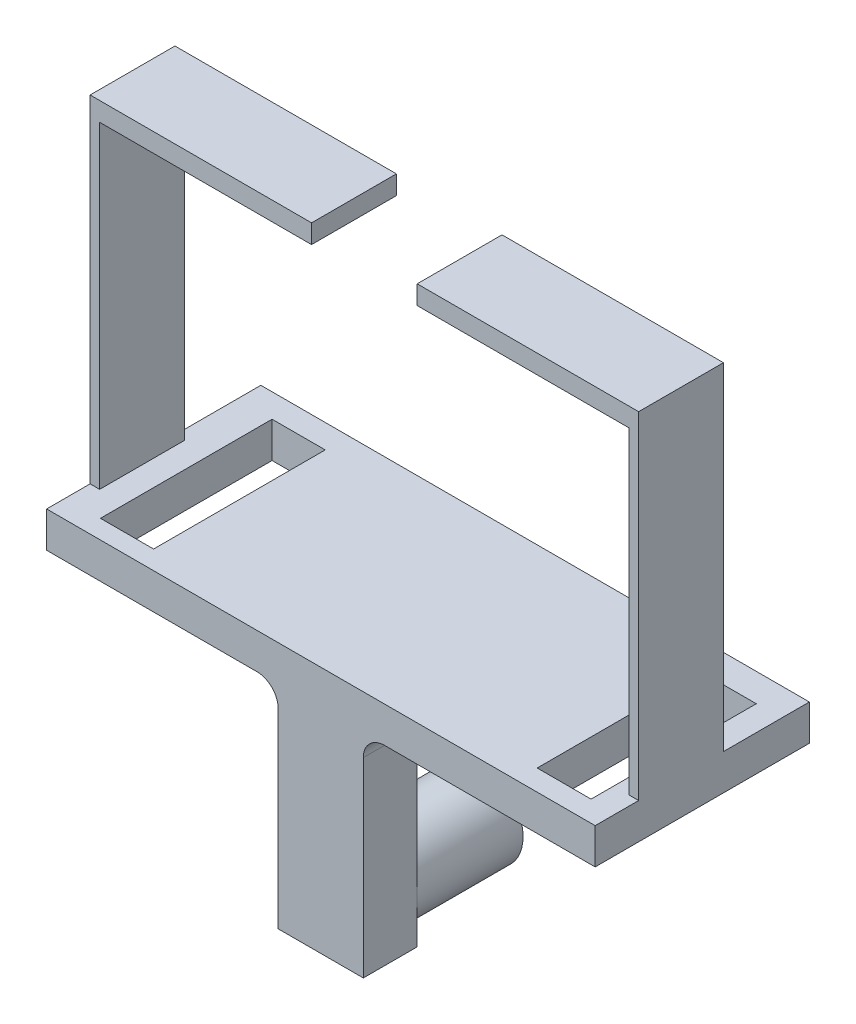
ISO-10303-21;
HEADER;
FILE_DESCRIPTION(('STEP AP214'),'2;1');
FILE_NAME('part.step','',(''),(''),'','','');
FILE_SCHEMA(('AUTOMOTIVE_DESIGN { 1 0 10303 214 1 1 1 1 }'));
ENDSEC;
DATA;
#1=APPLICATION_CONTEXT('core data for automotive mechanical design processes');
#2=APPLICATION_PROTOCOL_DEFINITION('international standard','automotive_design',2000,#1);
#3=PRODUCT_CONTEXT('',#1,'mechanical');
#4=PRODUCT('Part','Part','',(#3));
#5=PRODUCT_RELATED_PRODUCT_CATEGORY('part','',(#4));
#6=PRODUCT_DEFINITION_FORMATION('','',#4);
#7=PRODUCT_DEFINITION_CONTEXT('part definition',#1,'design');
#8=PRODUCT_DEFINITION('design','',#6,#7);
#9=PRODUCT_DEFINITION_SHAPE('','',#8);
#10=(LENGTH_UNIT() NAMED_UNIT(*) SI_UNIT(.MILLI.,.METRE.));
#11=(NAMED_UNIT(*) PLANE_ANGLE_UNIT() SI_UNIT($,.RADIAN.));
#12=(NAMED_UNIT(*) SI_UNIT($,.STERADIAN.) SOLID_ANGLE_UNIT());
#13=UNCERTAINTY_MEASURE_WITH_UNIT(LENGTH_MEASURE(1.E-05),#10,'distance_accuracy_value','');
#14=(GEOMETRIC_REPRESENTATION_CONTEXT(3) GLOBAL_UNCERTAINTY_ASSIGNED_CONTEXT((#13)) GLOBAL_UNIT_ASSIGNED_CONTEXT((#10,
#11,#12)) REPRESENTATION_CONTEXT('',''));
#15=CARTESIAN_POINT('',(0.,0.,0.));
#16=DIRECTION('',(0.,0.,1.));
#17=DIRECTION('',(1.,0.,0.));
#18=AXIS2_PLACEMENT_3D('',#15,#16,#17);
#19=CARTESIAN_POINT('',(0.,29.68752,0.));
#20=DIRECTION('',(0.,-1.,0.));
#21=DIRECTION('',(0.,0.,-1.));
#22=AXIS2_PLACEMENT_3D('',#19,#20,#21);
#23=PLANE('',#22);
#24=DIRECTION('',(0.,0.,1.));
#25=VECTOR('',#24,1.);
#26=CARTESIAN_POINT('',(-40.8068433770587,29.68752,-30.4384638888355));
#27=LINE('',#26,#25);
#28=CARTESIAN_POINT('',(-40.8068433770587,29.68752,-30.4384638888355));
#29=VERTEX_POINT('',#28);
#30=CARTESIAN_POINT('',(-40.8068433770587,29.68752,-9.88129462476957));
#31=VERTEX_POINT('',#30);
#32=EDGE_CURVE('E471',#29,#31,#27,.T.);
#33=ORIENTED_EDGE('',*,*,#32,.F.);
#34=DIRECTION('',(-1.,0.,0.));
#35=VECTOR('',#34,1.);
#36=CARTESIAN_POINT('',(-40.8068433770587,29.68752,-30.4384638888355));
#37=LINE('',#36,#35);
#38=CARTESIAN_POINT('',(-34.4388221289384,29.68752,-30.4384638888355));
#39=VERTEX_POINT('',#38);
#40=EDGE_CURVE('E485',#39,#29,#37,.T.);
#41=ORIENTED_EDGE('',*,*,#40,.F.);
#42=DIRECTION('',(0.,0.,-1.));
#43=VECTOR('',#42,1.);
#44=CARTESIAN_POINT('',(-34.4388221289384,29.68752,-30.4384638888355));
#45=LINE('',#44,#43);
#46=CARTESIAN_POINT('',(-34.4388221289384,29.68752,-9.88129462476957));
#47=VERTEX_POINT('',#46);
#48=EDGE_CURVE('E478',#47,#39,#45,.T.);
#49=ORIENTED_EDGE('',*,*,#48,.F.);
#50=DIRECTION('',(1.,0.,0.));
#51=VECTOR('',#50,1.);
#52=CARTESIAN_POINT('',(-40.8068433770587,29.68752,-9.88129462476957));
#53=LINE('',#52,#51);
#54=EDGE_CURVE('E477',#31,#47,#53,.T.);
#55=ORIENTED_EDGE('',*,*,#54,.F.);
#56=EDGE_LOOP('',(#33,#41,#49,#55));
#57=FACE_BOUND('',#56,.T.);
#58=DIRECTION('',(0.,0.,1.));
#59=VECTOR('',#58,1.);
#60=CARTESIAN_POINT('',(11.2485249465012,29.68752,-29.9256031171748));
#61=LINE('',#60,#59);
#62=CARTESIAN_POINT('',(11.2485249465012,29.68752,-29.9256031171748));
#63=VERTEX_POINT('',#62);
#64=CARTESIAN_POINT('',(11.2485249465012,29.68752,-10.1377250105999));
#65=VERTEX_POINT('',#64);
#66=EDGE_CURVE('E429',#63,#65,#61,.T.);
#67=ORIENTED_EDGE('',*,*,#66,.F.);
#68=DIRECTION('',(-1.,0.,0.));
#69=VECTOR('',#68,1.);
#70=CARTESIAN_POINT('',(11.2485249465012,29.68752,-29.9256031171748));
#71=LINE('',#70,#69);
#72=CARTESIAN_POINT('',(17.7020229898982,29.68752,-29.9256031171748));
#73=VERTEX_POINT('',#72);
#74=EDGE_CURVE('E444',#73,#63,#71,.T.);
#75=ORIENTED_EDGE('',*,*,#74,.F.);
#76=DIRECTION('',(0.,0.,-1.));
#77=VECTOR('',#76,1.);
#78=CARTESIAN_POINT('',(17.7020229898982,29.68752,-29.9256031171748));
#79=LINE('',#78,#77);
#80=CARTESIAN_POINT('',(17.7020229898982,29.68752,-10.1377250105999));
#81=VERTEX_POINT('',#80);
#82=EDGE_CURVE('E440',#81,#73,#79,.T.);
#83=ORIENTED_EDGE('',*,*,#82,.F.);
#84=DIRECTION('',(1.,0.,0.));
#85=VECTOR('',#84,1.);
#86=CARTESIAN_POINT('',(11.2485249465012,29.68752,-10.1377250105999));
#87=LINE('',#86,#85);
#88=EDGE_CURVE('E434',#65,#81,#87,.T.);
#89=ORIENTED_EDGE('',*,*,#88,.F.);
#90=EDGE_LOOP('',(#67,#75,#83,#89));
#91=FACE_BOUND('',#90,.T.);
#92=DIRECTION('',(1.,0.,0.));
#93=VECTOR('',#92,1.);
#94=CARTESIAN_POINT('',(-44.9980277605177,29.68752,-12.8390480402712));
#95=LINE('',#94,#93);
#96=CARTESIAN_POINT('',(-44.9980277605177,29.68752,-12.8390480402712));
#97=VERTEX_POINT('',#96);
#98=CARTESIAN_POINT('',(-43.8550277605177,29.68752,-12.8390480402712));
#99=VERTEX_POINT('',#98);
#100=EDGE_CURVE('E380',#97,#99,#95,.T.);
#101=ORIENTED_EDGE('',*,*,#100,.F.);
#102=DIRECTION('',(0.,0.,1.));
#103=VECTOR('',#102,1.);
#104=CARTESIAN_POINT('',(-44.9980277605177,29.68752,-7.63204804027117));
#105=LINE('',#104,#103);
#106=CARTESIAN_POINT('',(-44.9980277605177,29.68752,-7.63204804027117));
#107=VERTEX_POINT('',#106);
#108=EDGE_CURVE('E295',#97,#107,#105,.T.);
#109=ORIENTED_EDGE('',*,*,#108,.T.);
#110=DIRECTION('',(1.,0.,0.));
#111=VECTOR('',#110,1.);
#112=CARTESIAN_POINT('',(-44.9980277605177,29.68752,-7.63204804027117));
#113=LINE('',#112,#111);
#114=CARTESIAN_POINT('',(20.6965322394823,29.68752,-7.63204804027119));
#115=VERTEX_POINT('',#114);
#116=EDGE_CURVE('E527',#107,#115,#113,.T.);
#117=ORIENTED_EDGE('',*,*,#116,.T.);
#118=DIRECTION('',(0.,0.,-1.));
#119=VECTOR('',#118,1.);
#120=CARTESIAN_POINT('',(20.6965322394823,29.68752,-7.63204804027119));
#121=LINE('',#120,#119);
#122=CARTESIAN_POINT('',(20.6965322394823,29.68752,-12.8390480402712));
#123=VERTEX_POINT('',#122);
#124=EDGE_CURVE('E519',#115,#123,#121,.T.);
#125=ORIENTED_EDGE('',*,*,#124,.T.);
#126=DIRECTION('',(1.,0.,0.));
#127=VECTOR('',#126,1.);
#128=CARTESIAN_POINT('',(20.6965322394823,29.68752,-12.8390480402712));
#129=LINE('',#128,#127);
#130=CARTESIAN_POINT('',(19.5535322394823,29.68752,-12.8390480402712));
#131=VERTEX_POINT('',#130);
#132=EDGE_CURVE('E416',#131,#123,#129,.T.);
#133=ORIENTED_EDGE('',*,*,#132,.F.);
#134=DIRECTION('',(0.,0.,1.));
#135=VECTOR('',#134,1.);
#136=CARTESIAN_POINT('',(19.5535322394823,29.68752,-22.9990480402712));
#137=LINE('',#136,#135);
#138=CARTESIAN_POINT('',(19.5535322394823,29.68752,-22.9990480402712));
#139=VERTEX_POINT('',#138);
#140=EDGE_CURVE('E419',#139,#131,#137,.T.);
#141=ORIENTED_EDGE('',*,*,#140,.F.);
#142=DIRECTION('',(-1.,0.,0.));
#143=VECTOR('',#142,1.);
#144=CARTESIAN_POINT('',(20.6965322394823,29.68752,-22.9990480402712));
#145=LINE('',#144,#143);
#146=CARTESIAN_POINT('',(20.6965322394823,29.68752,-22.9990480402712));
#147=VERTEX_POINT('',#146);
#148=EDGE_CURVE('E384',#147,#139,#145,.T.);
#149=ORIENTED_EDGE('',*,*,#148,.F.);
#150=CARTESIAN_POINT('',(20.6965322394823,29.68752,-33.2860480402712));
#151=VERTEX_POINT('',#150);
#152=EDGE_CURVE('E517',#147,#151,#121,.T.);
#153=ORIENTED_EDGE('',*,*,#152,.T.);
#154=DIRECTION('',(-1.,0.,0.));
#155=VECTOR('',#154,1.);
#156=CARTESIAN_POINT('',(-44.9980277605177,29.68752,-33.2860480402712));
#157=LINE('',#156,#155);
#158=CARTESIAN_POINT('',(-44.9980277605177,29.68752,-33.2860480402712));
#159=VERTEX_POINT('',#158);
#160=EDGE_CURVE('E518',#151,#159,#157,.T.);
#161=ORIENTED_EDGE('',*,*,#160,.T.);
#162=CARTESIAN_POINT('',(-44.9980277605177,29.68752,-22.9990480402712));
#163=VERTEX_POINT('',#162);
#164=EDGE_CURVE('E521',#159,#163,#105,.T.);
#165=ORIENTED_EDGE('',*,*,#164,.T.);
#166=DIRECTION('',(-1.,0.,0.));
#167=VECTOR('',#166,1.);
#168=CARTESIAN_POINT('',(-44.9980277605177,29.68752,-22.9990480402712));
#169=LINE('',#168,#167);
#170=CARTESIAN_POINT('',(-43.8550277605177,29.68752,-22.9990480402712));
#171=VERTEX_POINT('',#170);
#172=EDGE_CURVE('E381',#171,#163,#169,.T.);
#173=ORIENTED_EDGE('',*,*,#172,.F.);
#174=DIRECTION('',(0.,0.,-1.));
#175=VECTOR('',#174,1.);
#176=CARTESIAN_POINT('',(-43.8550277605177,29.68752,-12.8390480402712));
#177=LINE('',#176,#175);
#178=EDGE_CURVE('E376',#99,#171,#177,.T.);
#179=ORIENTED_EDGE('',*,*,#178,.F.);
#180=EDGE_LOOP('',(#101,#109,#117,#125,#133,#141,#149,#153,#161,#165,#173,#179));
#181=FACE_BOUND('',#180,.T.);
#182=ADVANCED_FACE('F72',(#57,#91,#181),#23,.F.);
#183=CARTESIAN_POINT('',(-17.2688477605177,25.4,-14.0633280402712));
#184=DIRECTION('',(0.,0.,1.));
#185=DIRECTION('',(1.,0.,0.));
#186=AXIS2_PLACEMENT_3D('',#183,#184,#185);
#187=PLANE('',#186);
#188=DIRECTION('',(0.,-1.,0.));
#189=VECTOR('',#188,1.);
#190=CARTESIAN_POINT('',(-17.2688477605177,25.4,-14.0633280402712));
#191=LINE('',#190,#189);
#192=CARTESIAN_POINT('',(-17.2688477605177,5.098542,-14.0633280402712));
#193=VERTEX_POINT('',#192);
#194=CARTESIAN_POINT('',(-17.2688477605177,0.,-14.0633280402712));
#195=VERTEX_POINT('',#194);
#196=EDGE_CURVE('E586',#193,#195,#191,.T.);
#197=ORIENTED_EDGE('',*,*,#196,.F.);
#198=CARTESIAN_POINT('',(-12.1697977605177,5.098542,-14.0633280402712));
#199=DIRECTION('',(0.,0.,1.));
#200=DIRECTION('',(1.,0.,0.));
#201=AXIS2_PLACEMENT_3D('',#198,#199,#200);
#202=CIRCLE('',#201,5.09905);
#203=CARTESIAN_POINT('',(-12.241772594564,0.,-14.0633280402712));
#204=VERTEX_POINT('',#203);
#205=EDGE_CURVE('E575',#193,#204,#202,.T.);
#206=ORIENTED_EDGE('',*,*,#205,.T.);
#207=DIRECTION('',(-1.,0.,0.));
#208=VECTOR('',#207,1.);
#209=CARTESIAN_POINT('',(-17.2688477605177,0.,-14.0633280402712));
#210=LINE('',#209,#208);
#211=EDGE_CURVE('E599',#204,#195,#210,.T.);
#212=ORIENTED_EDGE('',*,*,#211,.T.);
#213=EDGE_LOOP('',(#197,#206,#212));
#214=FACE_BOUND('',#213,.T.);
#215=ADVANCED_FACE('F679',(#214),#187,.F.);
#216=CARTESIAN_POINT('',(-17.2688477605177,22.86,-14.0633280402712));
#217=VERTEX_POINT('',#216);
#218=EDGE_CURVE('E598',#217,#193,#191,.T.);
#219=ORIENTED_EDGE('',*,*,#218,.F.);
#220=DIRECTION('',(-1.,0.,0.));
#221=VECTOR('',#220,1.);
#222=CARTESIAN_POINT('',(-17.2688477605177,22.86,-14.0633280402712));
#223=LINE('',#222,#221);
#224=CARTESIAN_POINT('',(-7.0707477605177,22.86,-14.0633280402712));
#225=VERTEX_POINT('',#224);
#226=EDGE_CURVE('E603',#217,#225,#223,.F.);
#227=ORIENTED_EDGE('',*,*,#226,.T.);
#228=DIRECTION('',(0.,-1.,0.));
#229=VECTOR('',#228,1.);
#230=CARTESIAN_POINT('',(-7.0707477605177,25.4,-14.0633280402712));
#231=LINE('',#230,#229);
#232=CARTESIAN_POINT('',(-7.0707477605177,5.098542,-14.0633280402712));
#233=VERTEX_POINT('',#232);
#234=EDGE_CURVE('E638',#225,#233,#231,.T.);
#235=ORIENTED_EDGE('',*,*,#234,.T.);
#236=EDGE_CURVE('E560',#233,#193,#202,.T.);
#237=ORIENTED_EDGE('',*,*,#236,.T.);
#238=EDGE_LOOP('',(#219,#227,#235,#237));
#239=FACE_BOUND('',#238,.T.);
#240=ADVANCED_FACE('F634',(#239),#187,.F.);
#241=CARTESIAN_POINT('',(-17.2688477605177,25.4,-14.0633280402712));
#242=DIRECTION('',(1.,0.,0.));
#243=DIRECTION('',(0.,0.,-1.));
#244=AXIS2_PLACEMENT_3D('',#241,#242,#243);
#245=PLANE('',#244);
#246=DIRECTION('',(0.,-1.,0.));
#247=VECTOR('',#246,1.);
#248=CARTESIAN_POINT('',(-17.2688477605177,25.4,-7.63204804027118));
#249=LINE('',#248,#247);
#250=CARTESIAN_POINT('',(-17.2688477605177,22.86,-7.63204804027118));
#251=VERTEX_POINT('',#250);
#252=CARTESIAN_POINT('',(-17.2688477605177,0.,-7.63204804027118));
#253=VERTEX_POINT('',#252);
#254=EDGE_CURVE('E579',#251,#253,#249,.T.);
#255=ORIENTED_EDGE('',*,*,#254,.F.);
#256=DIRECTION('',(0.,0.,1.));
#257=VECTOR('',#256,1.);
#258=CARTESIAN_POINT('',(-17.2688477605177,22.86,-14.0633280402712));
#259=LINE('',#258,#257);
#260=EDGE_CURVE('E614',#251,#217,#259,.F.);
#261=ORIENTED_EDGE('',*,*,#260,.T.);
#262=ORIENTED_EDGE('',*,*,#218,.T.);
#263=ORIENTED_EDGE('',*,*,#196,.T.);
#264=DIRECTION('',(0.,0.,1.));
#265=VECTOR('',#264,1.);
#266=CARTESIAN_POINT('',(-17.2688477605177,0.,-14.0633280402712));
#267=LINE('',#266,#265);
#268=EDGE_CURVE('E564',#195,#253,#267,.T.);
#269=ORIENTED_EDGE('',*,*,#268,.T.);
#270=EDGE_LOOP('',(#255,#261,#262,#263,#269));
#271=FACE_BOUND('',#270,.T.);
#272=ADVANCED_FACE('F689',(#271),#245,.F.);
#273=CARTESIAN_POINT('',(-17.2688477605177,25.4,-7.63204804027118));
#274=DIRECTION('',(0.,0.,-1.));
#275=DIRECTION('',(-1.,0.,0.));
#276=AXIS2_PLACEMENT_3D('',#273,#274,#275);
#277=PLANE('',#276);
#278=DIRECTION('',(1.,0.,0.));
#279=VECTOR('',#278,1.);
#280=CARTESIAN_POINT('',(-17.2688477605177,0.,-7.63204804027118));
#281=LINE('',#280,#279);
#282=CARTESIAN_POINT('',(-7.0707477605177,0.,-7.63204804027118));
#283=VERTEX_POINT('',#282);
#284=EDGE_CURVE('E658',#253,#283,#281,.T.);
#285=ORIENTED_EDGE('',*,*,#284,.T.);
#286=DIRECTION('',(0.,-1.,0.));
#287=VECTOR('',#286,1.);
#288=CARTESIAN_POINT('',(-7.0707477605177,25.4,-7.63204804027118));
#289=LINE('',#288,#287);
#290=CARTESIAN_POINT('',(-7.0707477605177,22.86,-7.63204804027118));
#291=VERTEX_POINT('',#290);
#292=EDGE_CURVE('E643',#291,#283,#289,.T.);
#293=ORIENTED_EDGE('',*,*,#292,.F.);
#294=CARTESIAN_POINT('',(-4.5307477605177,22.86,-7.63204804027118));
#295=DIRECTION('',(0.,0.,-1.));
#296=DIRECTION('',(-1.,0.,0.));
#297=AXIS2_PLACEMENT_3D('',#294,#295,#296);
#298=CIRCLE('',#297,2.54);
#299=CARTESIAN_POINT('',(-4.5307477605177,25.4,-7.63204804027119));
#300=VERTEX_POINT('',#299);
#301=EDGE_CURVE('E12',#291,#300,#298,.T.);
#302=ORIENTED_EDGE('',*,*,#301,.T.);
#303=DIRECTION('',(1.,0.,0.));
#304=VECTOR('',#303,1.);
#305=CARTESIAN_POINT('',(-44.9980277605177,25.4,-7.63204804027117));
#306=LINE('',#305,#304);
#307=CARTESIAN_POINT('',(20.6965322394823,25.4,-7.63204804027119));
#308=VERTEX_POINT('',#307);
#309=EDGE_CURVE('E536',#300,#308,#306,.T.);
#310=ORIENTED_EDGE('',*,*,#309,.T.);
#311=DIRECTION('',(0.,-1.,0.));
#312=VECTOR('',#311,1.);
#313=CARTESIAN_POINT('',(20.6965322394823,29.68752,-7.63204804027119));
#314=LINE('',#313,#312);
#315=EDGE_CURVE('E526',#115,#308,#314,.T.);
#316=ORIENTED_EDGE('',*,*,#315,.F.);
#317=ORIENTED_EDGE('',*,*,#116,.F.);
#318=DIRECTION('',(0.,-1.,0.));
#319=VECTOR('',#318,1.);
#320=CARTESIAN_POINT('',(-44.9980277605177,29.68752,-7.63204804027117));
#321=LINE('',#320,#319);
#322=CARTESIAN_POINT('',(-44.9980277605177,25.4,-7.63204804027117));
#323=VERTEX_POINT('',#322);
#324=EDGE_CURVE('E550',#107,#323,#321,.T.);
#325=ORIENTED_EDGE('',*,*,#324,.T.);
#326=CARTESIAN_POINT('',(-19.8088477605177,25.4,-7.63204804027118));
#327=VERTEX_POINT('',#326);
#328=EDGE_CURVE('E538',#323,#327,#306,.T.);
#329=ORIENTED_EDGE('',*,*,#328,.T.);
#330=CARTESIAN_POINT('',(-19.8088477605177,22.86,-7.63204804027118));
#331=DIRECTION('',(0.,0.,-1.));
#332=DIRECTION('',(-1.,0.,0.));
#333=AXIS2_PLACEMENT_3D('',#330,#331,#332);
#334=CIRCLE('',#333,2.54);
#335=EDGE_CURVE('E619',#327,#251,#334,.T.);
#336=ORIENTED_EDGE('',*,*,#335,.T.);
#337=ORIENTED_EDGE('',*,*,#254,.T.);
#338=EDGE_LOOP('',(#285,#293,#302,#310,#316,#317,#325,#329,#336,#337));
#339=FACE_BOUND('',#338,.T.);
#340=ADVANCED_FACE('F648',(#339),#277,.F.);
#341=CARTESIAN_POINT('',(-7.0707477605177,25.4,-14.0633280402712));
#342=DIRECTION('',(-1.,0.,0.));
#343=DIRECTION('',(0.,0.,1.));
#344=AXIS2_PLACEMENT_3D('',#341,#342,#343);
#345=PLANE('',#344);
#346=ORIENTED_EDGE('',*,*,#234,.F.);
#347=DIRECTION('',(0.,0.,-1.));
#348=VECTOR('',#347,1.);
#349=CARTESIAN_POINT('',(-7.0707477605177,22.86,-14.0633280402712));
#350=LINE('',#349,#348);
#351=EDGE_CURVE('E94',#225,#291,#350,.F.);
#352=ORIENTED_EDGE('',*,*,#351,.T.);
#353=ORIENTED_EDGE('',*,*,#292,.T.);
#354=DIRECTION('',(0.,0.,-1.));
#355=VECTOR('',#354,1.);
#356=CARTESIAN_POINT('',(-7.0707477605177,0.,-14.0633280402712));
#357=LINE('',#356,#355);
#358=CARTESIAN_POINT('',(-7.0707477605177,0.,-14.0633280402712));
#359=VERTEX_POINT('',#358);
#360=EDGE_CURVE('E593',#283,#359,#357,.T.);
#361=ORIENTED_EDGE('',*,*,#360,.T.);
#362=EDGE_CURVE('E641',#233,#359,#231,.T.);
#363=ORIENTED_EDGE('',*,*,#362,.F.);
#364=EDGE_LOOP('',(#346,#352,#353,#361,#363));
#365=FACE_BOUND('',#364,.T.);
#366=ADVANCED_FACE('F639',(#365),#345,.F.);
#367=CARTESIAN_POINT('',(-12.0978229264714,0.,-14.0633280402712));
#368=VERTEX_POINT('',#367);
#369=EDGE_CURVE('E583',#359,#368,#210,.T.);
#370=ORIENTED_EDGE('',*,*,#369,.T.);
#371=EDGE_CURVE('E576',#368,#233,#202,.T.);
#372=ORIENTED_EDGE('',*,*,#371,.T.);
#373=ORIENTED_EDGE('',*,*,#362,.T.);
#374=EDGE_LOOP('',(#370,#372,#373));
#375=FACE_BOUND('',#374,.T.);
#376=ADVANCED_FACE('F758',(#375),#187,.F.);
#377=CARTESIAN_POINT('',(0.,0.,0.));
#378=DIRECTION('',(0.,1.,0.));
#379=DIRECTION('',(0.,0.,1.));
#380=AXIS2_PLACEMENT_3D('',#377,#378,#379);
#381=PLANE('',#380);
#382=ORIENTED_EDGE('',*,*,#268,.F.);
#383=ORIENTED_EDGE('',*,*,#211,.F.);
#384=CARTESIAN_POINT('',(-12.1697977605177,5.098542,-14.0633280402712));
#385=DIRECTION('',(0.,0.,-1.));
#386=DIRECTION('',(0.0141153418864927,-0.999900373599004,0.));
#387=AXIS2_PLACEMENT_3D('',#384,#385,#386);
#388=CIRCLE('',#387,5.09905);
#389=EDGE_CURVE('E588',#368,#204,#388,.T.);
#390=ORIENTED_EDGE('',*,*,#389,.F.);
#391=ORIENTED_EDGE('',*,*,#369,.F.);
#392=ORIENTED_EDGE('',*,*,#360,.F.);
#393=ORIENTED_EDGE('',*,*,#284,.F.);
#394=EDGE_LOOP('',(#382,#383,#390,#391,#392,#393));
#395=FACE_BOUND('',#394,.T.);
#396=ADVANCED_FACE('F685',(#395),#381,.F.);
#397=CARTESIAN_POINT('',(-12.1697977605177,5.098542,-26.7633280402712));
#398=DIRECTION('',(0.,0.,1.));
#399=DIRECTION('',(1.,0.,0.));
#400=AXIS2_PLACEMENT_3D('',#397,#398,#399);
#401=CYLINDRICAL_SURFACE('',#400,5.09905);
#402=CARTESIAN_POINT('',(-12.1697977605177,5.098542,-26.7633280402712));
#403=DIRECTION('',(0.,0.,1.));
#404=DIRECTION('',(1.,0.,0.));
#405=AXIS2_PLACEMENT_3D('',#402,#403,#404);
#406=CIRCLE('',#405,5.09905);
#407=CARTESIAN_POINT('',(-7.0707477605177,5.098542,-26.7633280402712));
#408=VERTEX_POINT('',#407);
#409=EDGE_CURVE('E559',#408,#408,#406,.T.);
#410=ORIENTED_EDGE('',*,*,#409,.T.);
#411=EDGE_LOOP('',(#410));
#412=FACE_BOUND('',#411,.T.);
#413=ORIENTED_EDGE('',*,*,#236,.F.);
#414=ORIENTED_EDGE('',*,*,#371,.F.);
#415=ORIENTED_EDGE('',*,*,#389,.T.);
#416=ORIENTED_EDGE('',*,*,#205,.F.);
#417=EDGE_LOOP('',(#413,#414,#415,#416));
#418=FACE_BOUND('',#417,.T.);
#419=ADVANCED_FACE('F779',(#412,#418),#401,.T.);
#420=CARTESIAN_POINT('',(-12.1697977605177,5.098542,-26.7633280402712));
#421=DIRECTION('',(0.,0.,1.));
#422=DIRECTION('',(1.,0.,0.));
#423=AXIS2_PLACEMENT_3D('',#420,#421,#422);
#424=PLANE('',#423);
#425=CARTESIAN_POINT('',(-12.1697977605177,5.098542,-26.7633280402712));
#426=DIRECTION('',(0.,0.,-1.));
#427=DIRECTION('',(-1.,0.,0.));
#428=AXIS2_PLACEMENT_3D('',#425,#426,#427);
#429=CIRCLE('',#428,4.064);
#430=CARTESIAN_POINT('',(-16.2337977605177,5.098542,-26.7633280402712));
#431=VERTEX_POINT('',#430);
#432=EDGE_CURVE('E325',#431,#431,#429,.T.);
#433=ORIENTED_EDGE('',*,*,#432,.F.);
#434=EDGE_LOOP('',(#433));
#435=FACE_BOUND('',#434,.T.);
#436=ORIENTED_EDGE('',*,*,#409,.F.);
#437=EDGE_LOOP('',(#436));
#438=FACE_BOUND('',#437,.T.);
#439=ADVANCED_FACE('F768',(#435,#438),#424,.F.);
#440=CARTESIAN_POINT('',(0.,25.4,0.));
#441=DIRECTION('',(0.,-1.,0.));
#442=DIRECTION('',(0.,0.,-1.));
#443=AXIS2_PLACEMENT_3D('',#440,#441,#442);
#444=PLANE('',#443);
#445=ORIENTED_EDGE('',*,*,#309,.F.);
#446=DIRECTION('',(0.,0.,-1.));
#447=VECTOR('',#446,1.);
#448=CARTESIAN_POINT('',(-4.5307477605177,25.4,0.));
#449=LINE('',#448,#447);
#450=CARTESIAN_POINT('',(-4.5307477605177,25.4,-16.6033280402712));
#451=VERTEX_POINT('',#450);
#452=EDGE_CURVE('E625',#300,#451,#449,.T.);
#453=ORIENTED_EDGE('',*,*,#452,.T.);
#454=DIRECTION('',(-1.,0.,0.));
#455=VECTOR('',#454,1.);
#456=CARTESIAN_POINT('',(0.,25.4,-16.6033280402712));
#457=LINE('',#456,#455);
#458=CARTESIAN_POINT('',(-19.8088477605177,25.4,-16.6033280402712));
#459=VERTEX_POINT('',#458);
#460=EDGE_CURVE('E99',#451,#459,#457,.T.);
#461=ORIENTED_EDGE('',*,*,#460,.T.);
#462=DIRECTION('',(0.,0.,1.));
#463=VECTOR('',#462,1.);
#464=CARTESIAN_POINT('',(-19.8088477605177,25.4,0.));
#465=LINE('',#464,#463);
#466=EDGE_CURVE('E609',#459,#327,#465,.T.);
#467=ORIENTED_EDGE('',*,*,#466,.T.);
#468=ORIENTED_EDGE('',*,*,#328,.F.);
#469=DIRECTION('',(0.,0.,1.));
#470=VECTOR('',#469,1.);
#471=CARTESIAN_POINT('',(-44.9980277605177,25.4,-7.63204804027117));
#472=LINE('',#471,#470);
#473=CARTESIAN_POINT('',(-44.9980277605177,25.4,-33.2860480402712));
#474=VERTEX_POINT('',#473);
#475=EDGE_CURVE('E537',#474,#323,#472,.T.);
#476=ORIENTED_EDGE('',*,*,#475,.F.);
#477=DIRECTION('',(-1.,0.,0.));
#478=VECTOR('',#477,1.);
#479=CARTESIAN_POINT('',(-44.9980277605177,25.4,-33.2860480402712));
#480=LINE('',#479,#478);
#481=CARTESIAN_POINT('',(20.6965322394823,25.4,-33.2860480402712));
#482=VERTEX_POINT('',#481);
#483=EDGE_CURVE('E531',#482,#474,#480,.T.);
#484=ORIENTED_EDGE('',*,*,#483,.F.);
#485=DIRECTION('',(0.,0.,-1.));
#486=VECTOR('',#485,1.);
#487=CARTESIAN_POINT('',(20.6965322394823,25.4,-7.63204804027119));
#488=LINE('',#487,#486);
#489=EDGE_CURVE('E513',#308,#482,#488,.T.);
#490=ORIENTED_EDGE('',*,*,#489,.F.);
#491=EDGE_LOOP('',(#445,#453,#461,#467,#468,#476,#484,#490));
#492=FACE_BOUND('',#491,.T.);
#493=DIRECTION('',(-1.,0.,0.));
#494=VECTOR('',#493,1.);
#495=CARTESIAN_POINT('',(-40.8068433770587,25.4,-30.4384638888355));
#496=LINE('',#495,#494);
#497=CARTESIAN_POINT('',(-34.4388221289384,25.4,-30.4384638888355));
#498=VERTEX_POINT('',#497);
#499=CARTESIAN_POINT('',(-40.8068433770587,25.4,-30.4384638888355));
#500=VERTEX_POINT('',#499);
#501=EDGE_CURVE('E479',#498,#500,#496,.T.);
#502=ORIENTED_EDGE('',*,*,#501,.T.);
#503=DIRECTION('',(0.,0.,1.));
#504=VECTOR('',#503,1.);
#505=CARTESIAN_POINT('',(-40.8068433770587,25.4,-30.4384638888355));
#506=LINE('',#505,#504);
#507=CARTESIAN_POINT('',(-40.8068433770587,25.4,-9.88129462476957));
#508=VERTEX_POINT('',#507);
#509=EDGE_CURVE('E475',#500,#508,#506,.T.);
#510=ORIENTED_EDGE('',*,*,#509,.T.);
#511=DIRECTION('',(1.,0.,0.));
#512=VECTOR('',#511,1.);
#513=CARTESIAN_POINT('',(-40.8068433770587,25.4,-9.88129462476957));
#514=LINE('',#513,#512);
#515=CARTESIAN_POINT('',(-34.4388221289384,25.4,-9.88129462476957));
#516=VERTEX_POINT('',#515);
#517=EDGE_CURVE('E491',#508,#516,#514,.T.);
#518=ORIENTED_EDGE('',*,*,#517,.T.);
#519=DIRECTION('',(0.,0.,-1.));
#520=VECTOR('',#519,1.);
#521=CARTESIAN_POINT('',(-34.4388221289384,25.4,-30.4384638888355));
#522=LINE('',#521,#520);
#523=EDGE_CURVE('E494',#516,#498,#522,.T.);
#524=ORIENTED_EDGE('',*,*,#523,.T.);
#525=EDGE_LOOP('',(#502,#510,#518,#524));
#526=FACE_BOUND('',#525,.T.);
#527=DIRECTION('',(-1.,0.,0.));
#528=VECTOR('',#527,1.);
#529=CARTESIAN_POINT('',(11.2485249465012,25.4,-29.9256031171748));
#530=LINE('',#529,#528);
#531=CARTESIAN_POINT('',(17.7020229898982,25.4,-29.9256031171748));
#532=VERTEX_POINT('',#531);
#533=CARTESIAN_POINT('',(11.2485249465012,25.4,-29.9256031171748));
#534=VERTEX_POINT('',#533);
#535=EDGE_CURVE('E431',#532,#534,#530,.T.);
#536=ORIENTED_EDGE('',*,*,#535,.T.);
#537=DIRECTION('',(0.,0.,1.));
#538=VECTOR('',#537,1.);
#539=CARTESIAN_POINT('',(11.2485249465012,25.4,-29.9256031171748));
#540=LINE('',#539,#538);
#541=CARTESIAN_POINT('',(11.2485249465012,25.4,-10.1377250105999));
#542=VERTEX_POINT('',#541);
#543=EDGE_CURVE('E399',#534,#542,#540,.T.);
#544=ORIENTED_EDGE('',*,*,#543,.T.);
#545=DIRECTION('',(1.,0.,0.));
#546=VECTOR('',#545,1.);
#547=CARTESIAN_POINT('',(11.2485249465012,25.4,-10.1377250105999));
#548=LINE('',#547,#546);
#549=CARTESIAN_POINT('',(17.7020229898982,25.4,-10.1377250105999));
#550=VERTEX_POINT('',#549);
#551=EDGE_CURVE('E446',#542,#550,#548,.T.);
#552=ORIENTED_EDGE('',*,*,#551,.T.);
#553=DIRECTION('',(0.,0.,-1.));
#554=VECTOR('',#553,1.);
#555=CARTESIAN_POINT('',(17.7020229898982,25.4,-29.9256031171748));
#556=LINE('',#555,#554);
#557=EDGE_CURVE('E454',#550,#532,#556,.T.);
#558=ORIENTED_EDGE('',*,*,#557,.T.);
#559=EDGE_LOOP('',(#536,#544,#552,#558));
#560=FACE_BOUND('',#559,.T.);
#561=ADVANCED_FACE('F655',(#492,#526,#560),#444,.T.);
#562=CARTESIAN_POINT('',(20.6965322394823,29.68752,-7.63204804027119));
#563=DIRECTION('',(-1.,0.,0.));
#564=DIRECTION('',(0.,0.,1.));
#565=AXIS2_PLACEMENT_3D('',#562,#563,#564);
#566=PLANE('',#565);
#567=ORIENTED_EDGE('',*,*,#489,.T.);
#568=DIRECTION('',(0.,-1.,0.));
#569=VECTOR('',#568,1.);
#570=CARTESIAN_POINT('',(20.6965322394823,29.68752,-33.2860480402712));
#571=LINE('',#570,#569);
#572=EDGE_CURVE('E553',#151,#482,#571,.T.);
#573=ORIENTED_EDGE('',*,*,#572,.F.);
#574=ORIENTED_EDGE('',*,*,#152,.F.);
#575=DIRECTION('',(0.,-1.,0.));
#576=VECTOR('',#575,1.);
#577=CARTESIAN_POINT('',(20.6965322394823,67.76212,-22.9990480402712));
#578=LINE('',#577,#576);
#579=CARTESIAN_POINT('',(20.6965322394823,70.02272,-22.9990480402712));
#580=VERTEX_POINT('',#579);
#581=EDGE_CURVE('E341',#580,#147,#578,.T.);
#582=ORIENTED_EDGE('',*,*,#581,.F.);
#583=DIRECTION('',(0.,0.,-1.));
#584=VECTOR('',#583,1.);
#585=CARTESIAN_POINT('',(20.6965322394823,70.02272,-12.8390480402712));
#586=LINE('',#585,#584);
#587=CARTESIAN_POINT('',(20.6965322394823,70.02272,-12.8390480402712));
#588=VERTEX_POINT('',#587);
#589=EDGE_CURVE('E360',#588,#580,#586,.T.);
#590=ORIENTED_EDGE('',*,*,#589,.F.);
#591=DIRECTION('',(0.,-1.,0.));
#592=VECTOR('',#591,1.);
#593=CARTESIAN_POINT('',(20.6965322394823,67.76212,-12.8390480402712));
#594=LINE('',#593,#592);
#595=EDGE_CURVE('E413',#588,#123,#594,.T.);
#596=ORIENTED_EDGE('',*,*,#595,.T.);
#597=ORIENTED_EDGE('',*,*,#124,.F.);
#598=ORIENTED_EDGE('',*,*,#315,.T.);
#599=EDGE_LOOP('',(#567,#573,#574,#582,#590,#596,#597,#598));
#600=FACE_BOUND('',#599,.T.);
#601=ADVANCED_FACE('F701',(#600),#566,.F.);
#602=CARTESIAN_POINT('',(-44.9980277605177,29.68752,-33.2860480402712));
#603=DIRECTION('',(0.,0.,1.));
#604=DIRECTION('',(1.,0.,0.));
#605=AXIS2_PLACEMENT_3D('',#602,#603,#604);
#606=PLANE('',#605);
#607=ORIENTED_EDGE('',*,*,#483,.T.);
#608=DIRECTION('',(0.,-1.,0.));
#609=VECTOR('',#608,1.);
#610=CARTESIAN_POINT('',(-44.9980277605177,29.68752,-33.2860480402712));
#611=LINE('',#610,#609);
#612=EDGE_CURVE('E552',#159,#474,#611,.T.);
#613=ORIENTED_EDGE('',*,*,#612,.F.);
#614=ORIENTED_EDGE('',*,*,#160,.F.);
#615=ORIENTED_EDGE('',*,*,#572,.T.);
#616=EDGE_LOOP('',(#607,#613,#614,#615));
#617=FACE_BOUND('',#616,.T.);
#618=ADVANCED_FACE('F702',(#617),#606,.F.);
#619=CARTESIAN_POINT('',(-44.9980277605177,29.68752,-7.63204804027117));
#620=DIRECTION('',(1.,0.,0.));
#621=DIRECTION('',(0.,0.,-1.));
#622=AXIS2_PLACEMENT_3D('',#619,#620,#621);
#623=PLANE('',#622);
#624=ORIENTED_EDGE('',*,*,#475,.T.);
#625=ORIENTED_EDGE('',*,*,#324,.F.);
#626=ORIENTED_EDGE('',*,*,#108,.F.);
#627=DIRECTION('',(0.,-1.,0.));
#628=VECTOR('',#627,1.);
#629=CARTESIAN_POINT('',(-44.9980277605177,67.76212,-12.8390480402712));
#630=LINE('',#629,#628);
#631=CARTESIAN_POINT('',(-44.9980277605177,70.02272,-12.8390480402712));
#632=VERTEX_POINT('',#631);
#633=EDGE_CURVE('E287',#632,#97,#630,.T.);
#634=ORIENTED_EDGE('',*,*,#633,.F.);
#635=DIRECTION('',(0.,0.,1.));
#636=VECTOR('',#635,1.);
#637=CARTESIAN_POINT('',(-44.9980277605177,70.02272,-22.9990480402712));
#638=LINE('',#637,#636);
#639=CARTESIAN_POINT('',(-44.9980277605177,70.02272,-22.9990480402712));
#640=VERTEX_POINT('',#639);
#641=EDGE_CURVE('E294',#640,#632,#638,.T.);
#642=ORIENTED_EDGE('',*,*,#641,.F.);
#643=DIRECTION('',(0.,-1.,0.));
#644=VECTOR('',#643,1.);
#645=CARTESIAN_POINT('',(-44.9980277605177,67.76212,-22.9990480402712));
#646=LINE('',#645,#644);
#647=EDGE_CURVE('E300',#640,#163,#646,.T.);
#648=ORIENTED_EDGE('',*,*,#647,.T.);
#649=ORIENTED_EDGE('',*,*,#164,.F.);
#650=ORIENTED_EDGE('',*,*,#612,.T.);
#651=EDGE_LOOP('',(#624,#625,#626,#634,#642,#648,#649,#650));
#652=FACE_BOUND('',#651,.T.);
#653=ADVANCED_FACE('F289',(#652),#623,.F.);
#654=CARTESIAN_POINT('',(-40.8068433770587,29.68752,-30.4384638888355));
#655=DIRECTION('',(1.,0.,0.));
#656=DIRECTION('',(0.,0.,-1.));
#657=AXIS2_PLACEMENT_3D('',#654,#655,#656);
#658=PLANE('',#657);
#659=ORIENTED_EDGE('',*,*,#509,.F.);
#660=DIRECTION('',(0.,-1.,0.));
#661=VECTOR('',#660,1.);
#662=CARTESIAN_POINT('',(-40.8068433770587,29.68752,-30.4384638888355));
#663=LINE('',#662,#661);
#664=EDGE_CURVE('E490',#29,#500,#663,.T.);
#665=ORIENTED_EDGE('',*,*,#664,.F.);
#666=ORIENTED_EDGE('',*,*,#32,.T.);
#667=DIRECTION('',(0.,-1.,0.));
#668=VECTOR('',#667,1.);
#669=CARTESIAN_POINT('',(-40.8068433770587,29.68752,-9.88129462476957));
#670=LINE('',#669,#668);
#671=EDGE_CURVE('E512',#31,#508,#670,.T.);
#672=ORIENTED_EDGE('',*,*,#671,.T.);
#673=EDGE_LOOP('',(#659,#665,#666,#672));
#674=FACE_BOUND('',#673,.T.);
#675=ADVANCED_FACE('F763',(#674),#658,.T.);
#676=CARTESIAN_POINT('',(-40.8068433770587,29.68752,-9.88129462476957));
#677=DIRECTION('',(0.,0.,-1.));
#678=DIRECTION('',(-1.,0.,0.));
#679=AXIS2_PLACEMENT_3D('',#676,#677,#678);
#680=PLANE('',#679);
#681=ORIENTED_EDGE('',*,*,#517,.F.);
#682=ORIENTED_EDGE('',*,*,#671,.F.);
#683=ORIENTED_EDGE('',*,*,#54,.T.);
#684=DIRECTION('',(0.,-1.,0.));
#685=VECTOR('',#684,1.);
#686=CARTESIAN_POINT('',(-34.4388221289384,29.68752,-9.88129462476957));
#687=LINE('',#686,#685);
#688=EDGE_CURVE('E509',#47,#516,#687,.T.);
#689=ORIENTED_EDGE('',*,*,#688,.T.);
#690=EDGE_LOOP('',(#681,#682,#683,#689));
#691=FACE_BOUND('',#690,.T.);
#692=ADVANCED_FACE('F1016',(#691),#680,.T.);
#693=CARTESIAN_POINT('',(-34.4388221289384,29.68752,-30.4384638888355));
#694=DIRECTION('',(-1.,0.,0.));
#695=DIRECTION('',(0.,0.,1.));
#696=AXIS2_PLACEMENT_3D('',#693,#694,#695);
#697=PLANE('',#696);
#698=ORIENTED_EDGE('',*,*,#523,.F.);
#699=ORIENTED_EDGE('',*,*,#688,.F.);
#700=ORIENTED_EDGE('',*,*,#48,.T.);
#701=DIRECTION('',(0.,-1.,0.));
#702=VECTOR('',#701,1.);
#703=CARTESIAN_POINT('',(-34.4388221289384,29.68752,-30.4384638888355));
#704=LINE('',#703,#702);
#705=EDGE_CURVE('E504',#39,#498,#704,.T.);
#706=ORIENTED_EDGE('',*,*,#705,.T.);
#707=EDGE_LOOP('',(#698,#699,#700,#706));
#708=FACE_BOUND('',#707,.T.);
#709=ADVANCED_FACE('F1008',(#708),#697,.T.);
#710=CARTESIAN_POINT('',(-40.8068433770587,29.68752,-30.4384638888355));
#711=DIRECTION('',(0.,0.,1.));
#712=DIRECTION('',(1.,0.,0.));
#713=AXIS2_PLACEMENT_3D('',#710,#711,#712);
#714=PLANE('',#713);
#715=ORIENTED_EDGE('',*,*,#501,.F.);
#716=ORIENTED_EDGE('',*,*,#705,.F.);
#717=ORIENTED_EDGE('',*,*,#40,.T.);
#718=ORIENTED_EDGE('',*,*,#664,.T.);
#719=EDGE_LOOP('',(#715,#716,#717,#718));
#720=FACE_BOUND('',#719,.T.);
#721=ADVANCED_FACE('F998',(#720),#714,.T.);
#722=CARTESIAN_POINT('',(11.2485249465012,29.68752,-29.9256031171748));
#723=DIRECTION('',(1.,0.,0.));
#724=DIRECTION('',(0.,0.,-1.));
#725=AXIS2_PLACEMENT_3D('',#722,#723,#724);
#726=PLANE('',#725);
#727=ORIENTED_EDGE('',*,*,#543,.F.);
#728=DIRECTION('',(0.,-1.,0.));
#729=VECTOR('',#728,1.);
#730=CARTESIAN_POINT('',(11.2485249465012,29.68752,-29.9256031171748));
#731=LINE('',#730,#729);
#732=EDGE_CURVE('E443',#63,#534,#731,.T.);
#733=ORIENTED_EDGE('',*,*,#732,.F.);
#734=ORIENTED_EDGE('',*,*,#66,.T.);
#735=DIRECTION('',(0.,-1.,0.));
#736=VECTOR('',#735,1.);
#737=CARTESIAN_POINT('',(11.2485249465012,29.68752,-10.1377250105999));
#738=LINE('',#737,#736);
#739=EDGE_CURVE('E470',#65,#542,#738,.T.);
#740=ORIENTED_EDGE('',*,*,#739,.T.);
#741=EDGE_LOOP('',(#727,#733,#734,#740));
#742=FACE_BOUND('',#741,.T.);
#743=ADVANCED_FACE('F987',(#742),#726,.T.);
#744=CARTESIAN_POINT('',(11.2485249465012,29.68752,-10.1377250105999));
#745=DIRECTION('',(0.,0.,-1.));
#746=DIRECTION('',(-1.,0.,0.));
#747=AXIS2_PLACEMENT_3D('',#744,#745,#746);
#748=PLANE('',#747);
#749=ORIENTED_EDGE('',*,*,#551,.F.);
#750=ORIENTED_EDGE('',*,*,#739,.F.);
#751=ORIENTED_EDGE('',*,*,#88,.T.);
#752=DIRECTION('',(0.,-1.,0.));
#753=VECTOR('',#752,1.);
#754=CARTESIAN_POINT('',(17.7020229898982,29.68752,-10.1377250105999));
#755=LINE('',#754,#753);
#756=EDGE_CURVE('E463',#81,#550,#755,.T.);
#757=ORIENTED_EDGE('',*,*,#756,.T.);
#758=EDGE_LOOP('',(#749,#750,#751,#757));
#759=FACE_BOUND('',#758,.T.);
#760=ADVANCED_FACE('F977',(#759),#748,.T.);
#761=CARTESIAN_POINT('',(17.7020229898982,29.68752,-29.9256031171748));
#762=DIRECTION('',(-1.,0.,0.));
#763=DIRECTION('',(0.,0.,1.));
#764=AXIS2_PLACEMENT_3D('',#761,#762,#763);
#765=PLANE('',#764);
#766=ORIENTED_EDGE('',*,*,#557,.F.);
#767=ORIENTED_EDGE('',*,*,#756,.F.);
#768=ORIENTED_EDGE('',*,*,#82,.T.);
#769=DIRECTION('',(0.,-1.,0.));
#770=VECTOR('',#769,1.);
#771=CARTESIAN_POINT('',(17.7020229898982,29.68752,-29.9256031171748));
#772=LINE('',#771,#770);
#773=EDGE_CURVE('E465',#73,#532,#772,.T.);
#774=ORIENTED_EDGE('',*,*,#773,.T.);
#775=EDGE_LOOP('',(#766,#767,#768,#774));
#776=FACE_BOUND('',#775,.T.);
#777=ADVANCED_FACE('F969',(#776),#765,.T.);
#778=CARTESIAN_POINT('',(11.2485249465012,29.68752,-29.9256031171748));
#779=DIRECTION('',(0.,0.,1.));
#780=DIRECTION('',(1.,0.,0.));
#781=AXIS2_PLACEMENT_3D('',#778,#779,#780);
#782=PLANE('',#781);
#783=ORIENTED_EDGE('',*,*,#535,.F.);
#784=ORIENTED_EDGE('',*,*,#773,.F.);
#785=ORIENTED_EDGE('',*,*,#74,.T.);
#786=ORIENTED_EDGE('',*,*,#732,.T.);
#787=EDGE_LOOP('',(#783,#784,#785,#786));
#788=FACE_BOUND('',#787,.T.);
#789=ADVANCED_FACE('F932',(#788),#782,.T.);
#790=CARTESIAN_POINT('',(20.6965322394823,67.76212,-22.9990480402712));
#791=DIRECTION('',(0.,0.,1.));
#792=DIRECTION('',(1.,0.,0.));
#793=AXIS2_PLACEMENT_3D('',#790,#791,#792);
#794=PLANE('',#793);
#795=ORIENTED_EDGE('',*,*,#148,.T.);
#796=DIRECTION('',(0.,-1.,0.));
#797=VECTOR('',#796,1.);
#798=CARTESIAN_POINT('',(19.5535322394823,67.76212,-22.9990480402712));
#799=LINE('',#798,#797);
#800=CARTESIAN_POINT('',(19.5535322394823,67.76212,-22.9990480402712));
#801=VERTEX_POINT('',#800);
#802=EDGE_CURVE('E405',#801,#139,#799,.T.);
#803=ORIENTED_EDGE('',*,*,#802,.F.);
#804=DIRECTION('',(-1.,0.,0.));
#805=VECTOR('',#804,1.);
#806=CARTESIAN_POINT('',(20.6965322394823,67.76212,-22.9990480402712));
#807=LINE('',#806,#805);
#808=CARTESIAN_POINT('',(-5.8261477605177,67.76212,-22.9990480402712));
#809=VERTEX_POINT('',#808);
#810=EDGE_CURVE('E331',#801,#809,#807,.T.);
#811=ORIENTED_EDGE('',*,*,#810,.T.);
#812=DIRECTION('',(0.,-1.,0.));
#813=VECTOR('',#812,1.);
#814=CARTESIAN_POINT('',(-5.8261477605177,70.02272,-22.9990480402712));
#815=LINE('',#814,#813);
#816=CARTESIAN_POINT('',(-5.8261477605177,70.02272,-22.9990480402712));
#817=VERTEX_POINT('',#816);
#818=EDGE_CURVE('E345',#817,#809,#815,.T.);
#819=ORIENTED_EDGE('',*,*,#818,.F.);
#820=DIRECTION('',(-1.,0.,0.));
#821=VECTOR('',#820,1.);
#822=CARTESIAN_POINT('',(20.6965322394823,70.02272,-22.9990480402712));
#823=LINE('',#822,#821);
#824=EDGE_CURVE('E370',#580,#817,#823,.T.);
#825=ORIENTED_EDGE('',*,*,#824,.F.);
#826=ORIENTED_EDGE('',*,*,#581,.T.);
#827=EDGE_LOOP('',(#795,#803,#811,#819,#825,#826));
#828=FACE_BOUND('',#827,.T.);
#829=ADVANCED_FACE('F721',(#828),#794,.F.);
#830=CARTESIAN_POINT('',(19.5535322394823,67.76212,-22.9990480402712));
#831=DIRECTION('',(1.,0.,0.));
#832=DIRECTION('',(0.,0.,-1.));
#833=AXIS2_PLACEMENT_3D('',#830,#831,#832);
#834=PLANE('',#833);
#835=ORIENTED_EDGE('',*,*,#140,.T.);
#836=DIRECTION('',(0.,-1.,0.));
#837=VECTOR('',#836,1.);
#838=CARTESIAN_POINT('',(19.5535322394823,67.76212,-12.8390480402712));
#839=LINE('',#838,#837);
#840=CARTESIAN_POINT('',(19.5535322394823,67.76212,-12.8390480402712));
#841=VERTEX_POINT('',#840);
#842=EDGE_CURVE('E407',#841,#131,#839,.T.);
#843=ORIENTED_EDGE('',*,*,#842,.F.);
#844=DIRECTION('',(0.,0.,1.));
#845=VECTOR('',#844,1.);
#846=CARTESIAN_POINT('',(19.5535322394823,67.76212,-22.9990480402712));
#847=LINE('',#846,#845);
#848=EDGE_CURVE('E412',#801,#841,#847,.T.);
#849=ORIENTED_EDGE('',*,*,#848,.F.);
#850=ORIENTED_EDGE('',*,*,#802,.T.);
#851=EDGE_LOOP('',(#835,#843,#849,#850));
#852=FACE_BOUND('',#851,.T.);
#853=ADVANCED_FACE('F714',(#852),#834,.F.);
#854=CARTESIAN_POINT('',(20.6965322394823,67.76212,-12.8390480402712));
#855=DIRECTION('',(0.,0.,-1.));
#856=DIRECTION('',(-1.,0.,0.));
#857=AXIS2_PLACEMENT_3D('',#854,#855,#856);
#858=PLANE('',#857);
#859=ORIENTED_EDGE('',*,*,#132,.T.);
#860=ORIENTED_EDGE('',*,*,#595,.F.);
#861=DIRECTION('',(1.,0.,0.));
#862=VECTOR('',#861,1.);
#863=CARTESIAN_POINT('',(20.6965322394823,70.02272,-12.8390480402712));
#864=LINE('',#863,#862);
#865=CARTESIAN_POINT('',(-5.8261477605177,70.02272,-12.8390480402712));
#866=VERTEX_POINT('',#865);
#867=EDGE_CURVE('E351',#866,#588,#864,.T.);
#868=ORIENTED_EDGE('',*,*,#867,.F.);
#869=DIRECTION('',(0.,-1.,0.));
#870=VECTOR('',#869,1.);
#871=CARTESIAN_POINT('',(-5.8261477605177,70.02272,-12.8390480402712));
#872=LINE('',#871,#870);
#873=CARTESIAN_POINT('',(-5.8261477605177,67.76212,-12.8390480402712));
#874=VERTEX_POINT('',#873);
#875=EDGE_CURVE('E346',#866,#874,#872,.T.);
#876=ORIENTED_EDGE('',*,*,#875,.T.);
#877=DIRECTION('',(1.,0.,0.));
#878=VECTOR('',#877,1.);
#879=CARTESIAN_POINT('',(20.6965322394823,67.76212,-12.8390480402712));
#880=LINE('',#879,#878);
#881=EDGE_CURVE('E355',#874,#841,#880,.T.);
#882=ORIENTED_EDGE('',*,*,#881,.T.);
#883=ORIENTED_EDGE('',*,*,#842,.T.);
#884=EDGE_LOOP('',(#859,#860,#868,#876,#882,#883));
#885=FACE_BOUND('',#884,.T.);
#886=ADVANCED_FACE('F710',(#885),#858,.F.);
#887=CARTESIAN_POINT('',(-43.8550277605177,67.76212,-12.8390480402712));
#888=DIRECTION('',(-1.,0.,0.));
#889=DIRECTION('',(0.,0.,1.));
#890=AXIS2_PLACEMENT_3D('',#887,#888,#889);
#891=PLANE('',#890);
#892=ORIENTED_EDGE('',*,*,#178,.T.);
#893=DIRECTION('',(0.,-1.,0.));
#894=VECTOR('',#893,1.);
#895=CARTESIAN_POINT('',(-43.8550277605177,67.76212,-22.9990480402712));
#896=LINE('',#895,#894);
#897=CARTESIAN_POINT('',(-43.8550277605177,67.76212,-22.9990480402712));
#898=VERTEX_POINT('',#897);
#899=EDGE_CURVE('E392',#898,#171,#896,.T.);
#900=ORIENTED_EDGE('',*,*,#899,.F.);
#901=DIRECTION('',(0.,0.,-1.));
#902=VECTOR('',#901,1.);
#903=CARTESIAN_POINT('',(-43.8550277605177,67.76212,-12.8390480402712));
#904=LINE('',#903,#902);
#905=CARTESIAN_POINT('',(-43.8550277605177,67.76212,-12.8390480402712));
#906=VERTEX_POINT('',#905);
#907=EDGE_CURVE('E374',#906,#898,#904,.T.);
#908=ORIENTED_EDGE('',*,*,#907,.F.);
#909=DIRECTION('',(0.,-1.,0.));
#910=VECTOR('',#909,1.);
#911=CARTESIAN_POINT('',(-43.8550277605177,67.76212,-12.8390480402712));
#912=LINE('',#911,#910);
#913=EDGE_CURVE('E296',#906,#99,#912,.T.);
#914=ORIENTED_EDGE('',*,*,#913,.T.);
#915=EDGE_LOOP('',(#892,#900,#908,#914));
#916=FACE_BOUND('',#915,.T.);
#917=ADVANCED_FACE('F734',(#916),#891,.F.);
#918=CARTESIAN_POINT('',(-44.9980277605177,67.76212,-22.9990480402712));
#919=DIRECTION('',(0.,0.,1.));
#920=DIRECTION('',(1.,0.,0.));
#921=AXIS2_PLACEMENT_3D('',#918,#919,#920);
#922=PLANE('',#921);
#923=ORIENTED_EDGE('',*,*,#172,.T.);
#924=ORIENTED_EDGE('',*,*,#647,.F.);
#925=DIRECTION('',(-1.,0.,0.));
#926=VECTOR('',#925,1.);
#927=CARTESIAN_POINT('',(-44.9980277605177,70.02272,-22.9990480402712));
#928=LINE('',#927,#926);
#929=CARTESIAN_POINT('',(-18.4753477605177,70.02272,-22.9990480402712));
#930=VERTEX_POINT('',#929);
#931=EDGE_CURVE('E314',#930,#640,#928,.T.);
#932=ORIENTED_EDGE('',*,*,#931,.F.);
#933=DIRECTION('',(0.,-1.,0.));
#934=VECTOR('',#933,1.);
#935=CARTESIAN_POINT('',(-18.4753477605177,70.02272,-22.9990480402712));
#936=LINE('',#935,#934);
#937=CARTESIAN_POINT('',(-18.4753477605177,67.76212,-22.9990480402712));
#938=VERTEX_POINT('',#937);
#939=EDGE_CURVE('E326',#930,#938,#936,.T.);
#940=ORIENTED_EDGE('',*,*,#939,.T.);
#941=DIRECTION('',(-1.,0.,0.));
#942=VECTOR('',#941,1.);
#943=CARTESIAN_POINT('',(-44.9980277605177,67.76212,-22.9990480402712));
#944=LINE('',#943,#942);
#945=EDGE_CURVE('E313',#938,#898,#944,.T.);
#946=ORIENTED_EDGE('',*,*,#945,.T.);
#947=ORIENTED_EDGE('',*,*,#899,.T.);
#948=EDGE_LOOP('',(#923,#924,#932,#940,#946,#947));
#949=FACE_BOUND('',#948,.T.);
#950=ADVANCED_FACE('F729',(#949),#922,.F.);
#951=CARTESIAN_POINT('',(-44.9980277605177,67.76212,-12.8390480402712));
#952=DIRECTION('',(0.,0.,-1.));
#953=DIRECTION('',(-1.,0.,0.));
#954=AXIS2_PLACEMENT_3D('',#951,#952,#953);
#955=PLANE('',#954);
#956=ORIENTED_EDGE('',*,*,#100,.T.);
#957=ORIENTED_EDGE('',*,*,#913,.F.);
#958=DIRECTION('',(1.,0.,0.));
#959=VECTOR('',#958,1.);
#960=CARTESIAN_POINT('',(-44.9980277605177,67.76212,-12.8390480402712));
#961=LINE('',#960,#959);
#962=CARTESIAN_POINT('',(-18.4753477605177,67.76212,-12.8390480402712));
#963=VERTEX_POINT('',#962);
#964=EDGE_CURVE('E328',#906,#963,#961,.T.);
#965=ORIENTED_EDGE('',*,*,#964,.T.);
#966=DIRECTION('',(0.,-1.,0.));
#967=VECTOR('',#966,1.);
#968=CARTESIAN_POINT('',(-18.4753477605177,70.02272,-12.8390480402712));
#969=LINE('',#968,#967);
#970=CARTESIAN_POINT('',(-18.4753477605177,70.02272,-12.8390480402712));
#971=VERTEX_POINT('',#970);
#972=EDGE_CURVE('E301',#971,#963,#969,.T.);
#973=ORIENTED_EDGE('',*,*,#972,.F.);
#974=DIRECTION('',(1.,0.,0.));
#975=VECTOR('',#974,1.);
#976=CARTESIAN_POINT('',(-44.9980277605177,70.02272,-12.8390480402712));
#977=LINE('',#976,#975);
#978=EDGE_CURVE('E302',#632,#971,#977,.T.);
#979=ORIENTED_EDGE('',*,*,#978,.F.);
#980=ORIENTED_EDGE('',*,*,#633,.T.);
#981=EDGE_LOOP('',(#956,#957,#965,#973,#979,#980));
#982=FACE_BOUND('',#981,.T.);
#983=ADVANCED_FACE('F304',(#982),#955,.F.);
#984=CARTESIAN_POINT('',(0.,67.76212,0.));
#985=DIRECTION('',(0.,1.,0.));
#986=DIRECTION('',(0.,0.,1.));
#987=AXIS2_PLACEMENT_3D('',#984,#985,#986);
#988=PLANE('',#987);
#989=ORIENTED_EDGE('',*,*,#964,.F.);
#990=ORIENTED_EDGE('',*,*,#907,.T.);
#991=ORIENTED_EDGE('',*,*,#945,.F.);
#992=DIRECTION('',(0.,0.,-1.));
#993=VECTOR('',#992,1.);
#994=CARTESIAN_POINT('',(-18.4753477605177,67.76212,-22.9990480402712));
#995=LINE('',#994,#993);
#996=EDGE_CURVE('E318',#963,#938,#995,.T.);
#997=ORIENTED_EDGE('',*,*,#996,.F.);
#998=EDGE_LOOP('',(#989,#990,#991,#997));
#999=FACE_BOUND('',#998,.T.);
#1000=ADVANCED_FACE('F739',(#999),#988,.F.);
#1001=CARTESIAN_POINT('',(-18.4753477605177,70.02272,-22.9990480402712));
#1002=DIRECTION('',(-1.,0.,0.));
#1003=DIRECTION('',(0.,0.,1.));
#1004=AXIS2_PLACEMENT_3D('',#1001,#1002,#1003);
#1005=PLANE('',#1004);
#1006=ORIENTED_EDGE('',*,*,#996,.T.);
#1007=ORIENTED_EDGE('',*,*,#939,.F.);
#1008=DIRECTION('',(0.,0.,-1.));
#1009=VECTOR('',#1008,1.);
#1010=CARTESIAN_POINT('',(-18.4753477605177,70.02272,-22.9990480402712));
#1011=LINE('',#1010,#1009);
#1012=EDGE_CURVE('E306',#971,#930,#1011,.T.);
#1013=ORIENTED_EDGE('',*,*,#1012,.F.);
#1014=ORIENTED_EDGE('',*,*,#972,.T.);
#1015=EDGE_LOOP('',(#1006,#1007,#1013,#1014));
#1016=FACE_BOUND('',#1015,.T.);
#1017=ADVANCED_FACE('F738',(#1016),#1005,.F.);
#1018=CARTESIAN_POINT('',(0.,70.02272,0.));
#1019=DIRECTION('',(0.,1.,0.));
#1020=DIRECTION('',(0.,0.,1.));
#1021=AXIS2_PLACEMENT_3D('',#1018,#1019,#1020);
#1022=PLANE('',#1021);
#1023=ORIENTED_EDGE('',*,*,#641,.T.);
#1024=ORIENTED_EDGE('',*,*,#978,.T.);
#1025=ORIENTED_EDGE('',*,*,#1012,.T.);
#1026=ORIENTED_EDGE('',*,*,#931,.T.);
#1027=EDGE_LOOP('',(#1023,#1024,#1025,#1026));
#1028=FACE_BOUND('',#1027,.T.);
#1029=ADVANCED_FACE('F312',(#1028),#1022,.T.);
#1030=CARTESIAN_POINT('',(0.,67.76212,0.));
#1031=DIRECTION('',(0.,1.,0.));
#1032=DIRECTION('',(0.,0.,1.));
#1033=AXIS2_PLACEMENT_3D('',#1030,#1031,#1032);
#1034=PLANE('',#1033);
#1035=ORIENTED_EDGE('',*,*,#810,.F.);
#1036=ORIENTED_EDGE('',*,*,#848,.T.);
#1037=ORIENTED_EDGE('',*,*,#881,.F.);
#1038=DIRECTION('',(0.,0.,1.));
#1039=VECTOR('',#1038,1.);
#1040=CARTESIAN_POINT('',(-5.8261477605177,67.76212,-12.8390480402712));
#1041=LINE('',#1040,#1039);
#1042=EDGE_CURVE('E357',#809,#874,#1041,.T.);
#1043=ORIENTED_EDGE('',*,*,#1042,.F.);
#1044=EDGE_LOOP('',(#1035,#1036,#1037,#1043));
#1045=FACE_BOUND('',#1044,.T.);
#1046=ADVANCED_FACE('F720',(#1045),#1034,.F.);
#1047=CARTESIAN_POINT('',(-5.8261477605177,70.02272,-12.8390480402712));
#1048=DIRECTION('',(1.,0.,0.));
#1049=DIRECTION('',(0.,0.,-1.));
#1050=AXIS2_PLACEMENT_3D('',#1047,#1048,#1049);
#1051=PLANE('',#1050);
#1052=ORIENTED_EDGE('',*,*,#1042,.T.);
#1053=ORIENTED_EDGE('',*,*,#875,.F.);
#1054=DIRECTION('',(0.,0.,1.));
#1055=VECTOR('',#1054,1.);
#1056=CARTESIAN_POINT('',(-5.8261477605177,70.02272,-12.8390480402712));
#1057=LINE('',#1056,#1055);
#1058=EDGE_CURVE('E363',#817,#866,#1057,.T.);
#1059=ORIENTED_EDGE('',*,*,#1058,.F.);
#1060=ORIENTED_EDGE('',*,*,#818,.T.);
#1061=EDGE_LOOP('',(#1052,#1053,#1059,#1060));
#1062=FACE_BOUND('',#1061,.T.);
#1063=ADVANCED_FACE('F724',(#1062),#1051,.F.);
#1064=CARTESIAN_POINT('',(0.,70.02272,0.));
#1065=DIRECTION('',(0.,1.,0.));
#1066=DIRECTION('',(0.,0.,1.));
#1067=AXIS2_PLACEMENT_3D('',#1064,#1065,#1066);
#1068=PLANE('',#1067);
#1069=ORIENTED_EDGE('',*,*,#589,.T.);
#1070=ORIENTED_EDGE('',*,*,#824,.T.);
#1071=ORIENTED_EDGE('',*,*,#1058,.T.);
#1072=ORIENTED_EDGE('',*,*,#867,.T.);
#1073=EDGE_LOOP('',(#1069,#1070,#1071,#1072));
#1074=FACE_BOUND('',#1073,.T.);
#1075=ADVANCED_FACE('F727',(#1074),#1068,.T.);
#1076=CARTESIAN_POINT('',(0.,22.86,-16.6033280402712));
#1077=DIRECTION('',(-1.,0.,0.));
#1078=DIRECTION('',(0.,0.,1.));
#1079=AXIS2_PLACEMENT_3D('',#1076,#1077,#1078);
#1080=CYLINDRICAL_SURFACE('',#1079,2.54);
#1081=ORIENTED_EDGE('',*,*,#460,.F.);
#1082=CARTESIAN_POINT('',(-4.5307477605177,22.86,-16.6033280402712));
#1083=DIRECTION('',(-0.707106781186548,0.,-0.707106781186547));
#1084=DIRECTION('',(-0.707106781186547,0.,0.707106781186548));
#1085=AXIS2_PLACEMENT_3D('',#1082,#1083,#1084);
#1086=ELLIPSE('',#1085,3.59210244842766,2.54);
#1087=EDGE_CURVE('E84',#451,#225,#1086,.F.);
#1088=ORIENTED_EDGE('',*,*,#1087,.T.);
#1089=ORIENTED_EDGE('',*,*,#226,.F.);
#1090=CARTESIAN_POINT('',(-19.8088477605177,22.86,-16.6033280402712));
#1091=DIRECTION('',(-0.707106781186547,0.,0.707106781186547));
#1092=DIRECTION('',(-0.707106781186547,0.,-0.707106781186547));
#1093=AXIS2_PLACEMENT_3D('',#1090,#1091,#1092);
#1094=ELLIPSE('',#1093,3.59210244842766,2.54);
#1095=EDGE_CURVE('E618',#217,#459,#1094,.T.);
#1096=ORIENTED_EDGE('',*,*,#1095,.T.);
#1097=EDGE_LOOP('',(#1081,#1088,#1089,#1096));
#1098=FACE_BOUND('',#1097,.T.);
#1099=ADVANCED_FACE('F626',(#1098),#1080,.F.);
#1100=CARTESIAN_POINT('',(-19.8088477605177,22.86,0.));
#1101=DIRECTION('',(0.,0.,1.));
#1102=DIRECTION('',(1.,0.,0.));
#1103=AXIS2_PLACEMENT_3D('',#1100,#1101,#1102);
#1104=CYLINDRICAL_SURFACE('',#1103,2.54);
#1105=ORIENTED_EDGE('',*,*,#1095,.F.);
#1106=ORIENTED_EDGE('',*,*,#260,.F.);
#1107=ORIENTED_EDGE('',*,*,#335,.F.);
#1108=ORIENTED_EDGE('',*,*,#466,.F.);
#1109=EDGE_LOOP('',(#1105,#1106,#1107,#1108));
#1110=FACE_BOUND('',#1109,.T.);
#1111=ADVANCED_FACE('F694',(#1110),#1104,.F.);
#1112=CARTESIAN_POINT('',(-4.5307477605177,22.86,0.));
#1113=DIRECTION('',(0.,0.,-1.));
#1114=DIRECTION('',(-1.,0.,0.));
#1115=AXIS2_PLACEMENT_3D('',#1112,#1113,#1114);
#1116=CYLINDRICAL_SURFACE('',#1115,2.54);
#1117=ORIENTED_EDGE('',*,*,#301,.F.);
#1118=ORIENTED_EDGE('',*,*,#351,.F.);
#1119=ORIENTED_EDGE('',*,*,#1087,.F.);
#1120=ORIENTED_EDGE('',*,*,#452,.F.);
#1121=EDGE_LOOP('',(#1117,#1118,#1119,#1120));
#1122=FACE_BOUND('',#1121,.T.);
#1123=ADVANCED_FACE('F79',(#1122),#1116,.F.);
#1124=CARTESIAN_POINT('',(-12.1697977605177,5.098542,-14.0633280402712));
#1125=DIRECTION('',(0.,0.,-1.));
#1126=DIRECTION('',(-1.,0.,0.));
#1127=AXIS2_PLACEMENT_3D('',#1124,#1125,#1126);
#1128=CYLINDRICAL_SURFACE('',#1127,4.064);
#1129=CARTESIAN_POINT('',(-12.1697977605177,5.098542,-14.0633280402712));
#1130=DIRECTION('',(0.,0.,-1.));
#1131=DIRECTION('',(-1.,0.,0.));
#1132=AXIS2_PLACEMENT_3D('',#1129,#1130,#1131);
#1133=CIRCLE('',#1132,4.064);
#1134=CARTESIAN_POINT('',(-16.2337977605177,5.098542,-14.0633280402712));
#1135=VERTEX_POINT('',#1134);
#1136=EDGE_CURVE('E350',#1135,#1135,#1133,.T.);
#1137=ORIENTED_EDGE('',*,*,#1136,.F.);
#1138=EDGE_LOOP('',(#1137));
#1139=FACE_BOUND('',#1138,.T.);
#1140=ORIENTED_EDGE('',*,*,#432,.T.);
#1141=EDGE_LOOP('',(#1140));
#1142=FACE_BOUND('',#1141,.T.);
#1143=ADVANCED_FACE('F807',(#1139,#1142),#1128,.F.);
#1144=CARTESIAN_POINT('',(-12.1697977605177,5.098542,-14.0633280402712));
#1145=DIRECTION('',(0.,0.,-1.));
#1146=DIRECTION('',(-1.,0.,0.));
#1147=AXIS2_PLACEMENT_3D('',#1144,#1145,#1146);
#1148=PLANE('',#1147);
#1149=ORIENTED_EDGE('',*,*,#1136,.T.);
#1150=EDGE_LOOP('',(#1149));
#1151=FACE_BOUND('',#1150,.T.);
#1152=ADVANCED_FACE('F808',(#1151),#1148,.T.);
#1153=CLOSED_SHELL('',(#182,#215,#240,#272,#340,#366,#376,#396,#419,#439,#561,#601,#618,#653,
#675,#692,#709,#721,#743,#760,#777,#789,#829,#853,#886,#917,#950,#983,#1000,#1017,#1029,#1046,
#1063,#1075,#1099,#1111,#1123,#1143,#1152));
#1154=MANIFOLD_SOLID_BREP('B2',#1153);
#1155=ADVANCED_BREP_SHAPE_REPRESENTATION('',(#18,#1154),#14);
#1156=SHAPE_DEFINITION_REPRESENTATION(#9,#1155);
ENDSEC;
END-ISO-10303-21;
